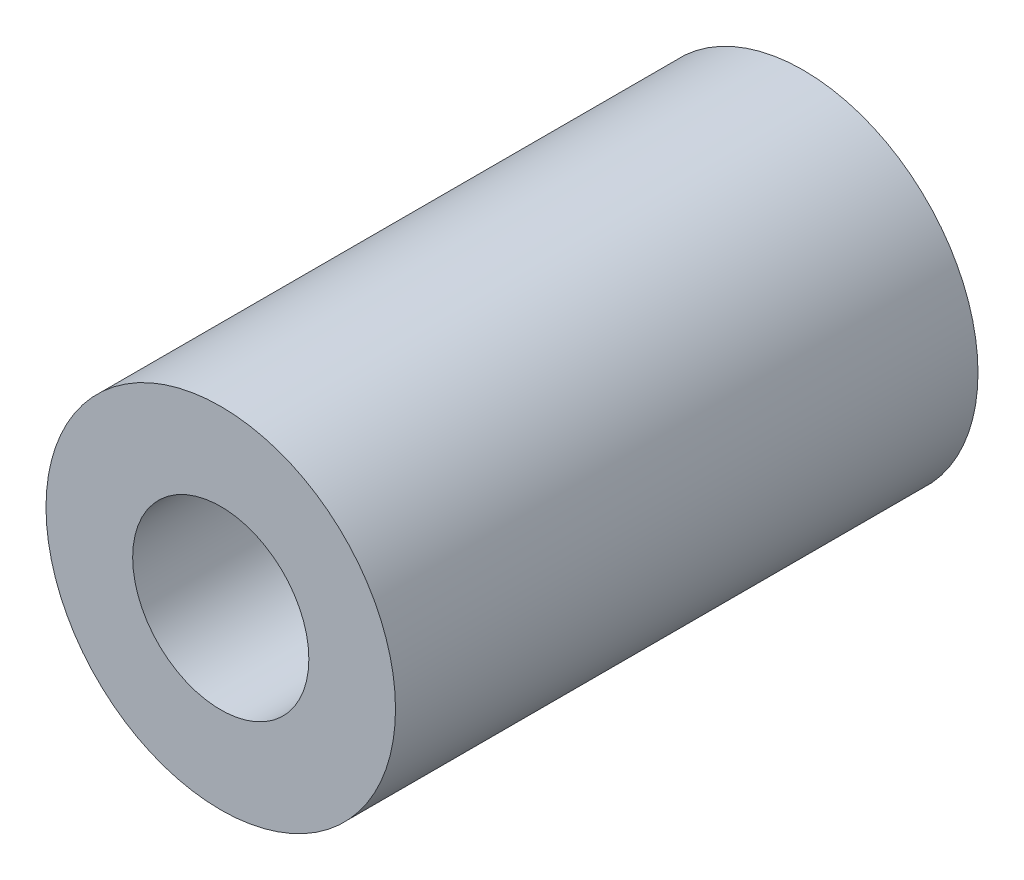
ISO-10303-21;
HEADER;
FILE_DESCRIPTION(('STEP AP214'),'2;1');
FILE_NAME('part.step','',(''),(''),'','','');
FILE_SCHEMA(('AUTOMOTIVE_DESIGN { 1 0 10303 214 1 1 1 1 }'));
ENDSEC;
DATA;
#1=APPLICATION_CONTEXT('core data for automotive mechanical design processes');
#2=APPLICATION_PROTOCOL_DEFINITION('international standard','automotive_design',2000,#1);
#3=PRODUCT_CONTEXT('',#1,'mechanical');
#4=PRODUCT('Part','Part','',(#3));
#5=PRODUCT_RELATED_PRODUCT_CATEGORY('part','',(#4));
#6=PRODUCT_DEFINITION_FORMATION('','',#4);
#7=PRODUCT_DEFINITION_CONTEXT('part definition',#1,'design');
#8=PRODUCT_DEFINITION('design','',#6,#7);
#9=PRODUCT_DEFINITION_SHAPE('','',#8);
#10=(LENGTH_UNIT() NAMED_UNIT(*) SI_UNIT(.MILLI.,.METRE.));
#11=(NAMED_UNIT(*) PLANE_ANGLE_UNIT() SI_UNIT($,.RADIAN.));
#12=(NAMED_UNIT(*) SI_UNIT($,.STERADIAN.) SOLID_ANGLE_UNIT());
#13=UNCERTAINTY_MEASURE_WITH_UNIT(LENGTH_MEASURE(1.E-05),#10,'distance_accuracy_value','');
#14=(GEOMETRIC_REPRESENTATION_CONTEXT(3) GLOBAL_UNCERTAINTY_ASSIGNED_CONTEXT((#13)) GLOBAL_UNIT_ASSIGNED_CONTEXT((#10,
#11,#12)) REPRESENTATION_CONTEXT('',''));
#15=CARTESIAN_POINT('',(0.,0.,0.));
#16=DIRECTION('',(0.,0.,1.));
#17=DIRECTION('',(1.,0.,0.));
#18=AXIS2_PLACEMENT_3D('',#15,#16,#17);
#19=CARTESIAN_POINT('',(0.,0.,20.));
#20=DIRECTION('',(0.,0.,-1.));
#21=DIRECTION('',(-1.,0.,0.));
#22=AXIS2_PLACEMENT_3D('',#19,#20,#21);
#23=CYLINDRICAL_SURFACE('',#22,6.);
#24=CARTESIAN_POINT('',(0.,0.,20.));
#25=DIRECTION('',(0.,0.,1.));
#26=DIRECTION('',(1.,0.,0.));
#27=AXIS2_PLACEMENT_3D('',#24,#25,#26);
#28=CIRCLE('',#27,6.);
#29=CARTESIAN_POINT('',(6.,0.,20.));
#30=VERTEX_POINT('',#29);
#31=EDGE_CURVE('E10',#30,#30,#28,.T.);
#32=ORIENTED_EDGE('',*,*,#31,.F.);
#33=EDGE_LOOP('',(#32));
#34=FACE_BOUND('',#33,.T.);
#35=CARTESIAN_POINT('',(0.,0.,0.));
#36=DIRECTION('',(0.,0.,1.));
#37=DIRECTION('',(1.,0.,0.));
#38=AXIS2_PLACEMENT_3D('',#35,#36,#37);
#39=CIRCLE('',#38,6.);
#40=CARTESIAN_POINT('',(6.,0.,0.));
#41=VERTEX_POINT('',#40);
#42=EDGE_CURVE('E37',#41,#41,#39,.T.);
#43=ORIENTED_EDGE('',*,*,#42,.T.);
#44=EDGE_LOOP('',(#43));
#45=FACE_BOUND('',#44,.T.);
#46=ADVANCED_FACE('F30',(#34,#45),#23,.T.);
#47=CARTESIAN_POINT('',(0.,0.,20.));
#48=DIRECTION('',(0.,0.,1.));
#49=DIRECTION('',(1.,0.,0.));
#50=AXIS2_PLACEMENT_3D('',#47,#48,#49);
#51=PLANE('',#50);
#52=CARTESIAN_POINT('',(0.,0.,20.));
#53=DIRECTION('',(0.,0.,1.));
#54=DIRECTION('',(1.,0.,0.));
#55=AXIS2_PLACEMENT_3D('',#52,#53,#54);
#56=CIRCLE('',#55,3.025);
#57=CARTESIAN_POINT('',(3.025,0.,20.));
#58=VERTEX_POINT('',#57);
#59=EDGE_CURVE('E49',#58,#58,#56,.T.);
#60=ORIENTED_EDGE('',*,*,#59,.F.);
#61=EDGE_LOOP('',(#60));
#62=FACE_BOUND('',#61,.T.);
#63=ORIENTED_EDGE('',*,*,#31,.T.);
#64=EDGE_LOOP('',(#63));
#65=FACE_BOUND('',#64,.T.);
#66=ADVANCED_FACE('F73',(#62,#65),#51,.T.);
#67=CARTESIAN_POINT('',(0.,0.,0.));
#68=DIRECTION('',(0.,0.,1.));
#69=DIRECTION('',(1.,0.,0.));
#70=AXIS2_PLACEMENT_3D('',#67,#68,#69);
#71=PLANE('',#70);
#72=CARTESIAN_POINT('',(0.,0.,0.));
#73=DIRECTION('',(0.,0.,-1.));
#74=DIRECTION('',(-1.,0.,0.));
#75=AXIS2_PLACEMENT_3D('',#72,#73,#74);
#76=CIRCLE('',#75,4.025);
#77=CARTESIAN_POINT('',(-4.025,0.,0.));
#78=VERTEX_POINT('',#77);
#79=EDGE_CURVE('E44',#78,#78,#76,.T.);
#80=ORIENTED_EDGE('',*,*,#79,.F.);
#81=EDGE_LOOP('',(#80));
#82=FACE_BOUND('',#81,.T.);
#83=ORIENTED_EDGE('',*,*,#42,.F.);
#84=EDGE_LOOP('',(#83));
#85=FACE_BOUND('',#84,.T.);
#86=ADVANCED_FACE('F67',(#82,#85),#71,.F.);
#87=CARTESIAN_POINT('',(0.,0.,6.));
#88=DIRECTION('',(0.,0.,-1.));
#89=DIRECTION('',(-1.,0.,0.));
#90=AXIS2_PLACEMENT_3D('',#87,#88,#89);
#91=CYLINDRICAL_SURFACE('',#90,4.025);
#92=CARTESIAN_POINT('',(0.,0.,6.));
#93=DIRECTION('',(0.,0.,-1.));
#94=DIRECTION('',(-1.,0.,0.));
#95=AXIS2_PLACEMENT_3D('',#92,#93,#94);
#96=CIRCLE('',#95,4.025);
#97=CARTESIAN_POINT('',(-4.025,0.,6.));
#98=VERTEX_POINT('',#97);
#99=EDGE_CURVE('E42',#98,#98,#96,.T.);
#100=ORIENTED_EDGE('',*,*,#99,.F.);
#101=EDGE_LOOP('',(#100));
#102=FACE_BOUND('',#101,.T.);
#103=ORIENTED_EDGE('',*,*,#79,.T.);
#104=EDGE_LOOP('',(#103));
#105=FACE_BOUND('',#104,.T.);
#106=ADVANCED_FACE('F61',(#102,#105),#91,.F.);
#107=CARTESIAN_POINT('',(0.,0.,6.));
#108=DIRECTION('',(0.,0.,-1.));
#109=DIRECTION('',(-1.,0.,0.));
#110=AXIS2_PLACEMENT_3D('',#107,#108,#109);
#111=PLANE('',#110);
#112=CARTESIAN_POINT('',(0.,0.,6.));
#113=DIRECTION('',(0.,0.,-1.));
#114=DIRECTION('',(-1.,0.,0.));
#115=AXIS2_PLACEMENT_3D('',#112,#113,#114);
#116=CIRCLE('',#115,3.025);
#117=CARTESIAN_POINT('',(-3.025,0.,6.));
#118=VERTEX_POINT('',#117);
#119=EDGE_CURVE('E33',#118,#118,#116,.T.);
#120=ORIENTED_EDGE('',*,*,#119,.F.);
#121=EDGE_LOOP('',(#120));
#122=FACE_BOUND('',#121,.T.);
#123=ORIENTED_EDGE('',*,*,#99,.T.);
#124=EDGE_LOOP('',(#123));
#125=FACE_BOUND('',#124,.T.);
#126=ADVANCED_FACE('F58',(#122,#125),#111,.T.);
#127=CARTESIAN_POINT('',(0.,0.,4.99999999999999));
#128=DIRECTION('',(0.,0.,1.));
#129=DIRECTION('',(1.,0.,0.));
#130=AXIS2_PLACEMENT_3D('',#127,#128,#129);
#131=CYLINDRICAL_SURFACE('',#130,3.025);
#132=ORIENTED_EDGE('',*,*,#119,.T.);
#133=EDGE_LOOP('',(#132));
#134=FACE_BOUND('',#133,.T.);
#135=ORIENTED_EDGE('',*,*,#59,.T.);
#136=EDGE_LOOP('',(#135));
#137=FACE_BOUND('',#136,.T.);
#138=ADVANCED_FACE('F56',(#134,#137),#131,.F.);
#139=CLOSED_SHELL('',(#46,#66,#86,#106,#126,#138));
#140=MANIFOLD_SOLID_BREP('B2',#139);
#141=ADVANCED_BREP_SHAPE_REPRESENTATION('',(#18,#140),#14);
#142=SHAPE_DEFINITION_REPRESENTATION(#9,#141);
ENDSEC;
END-ISO-10303-21;
